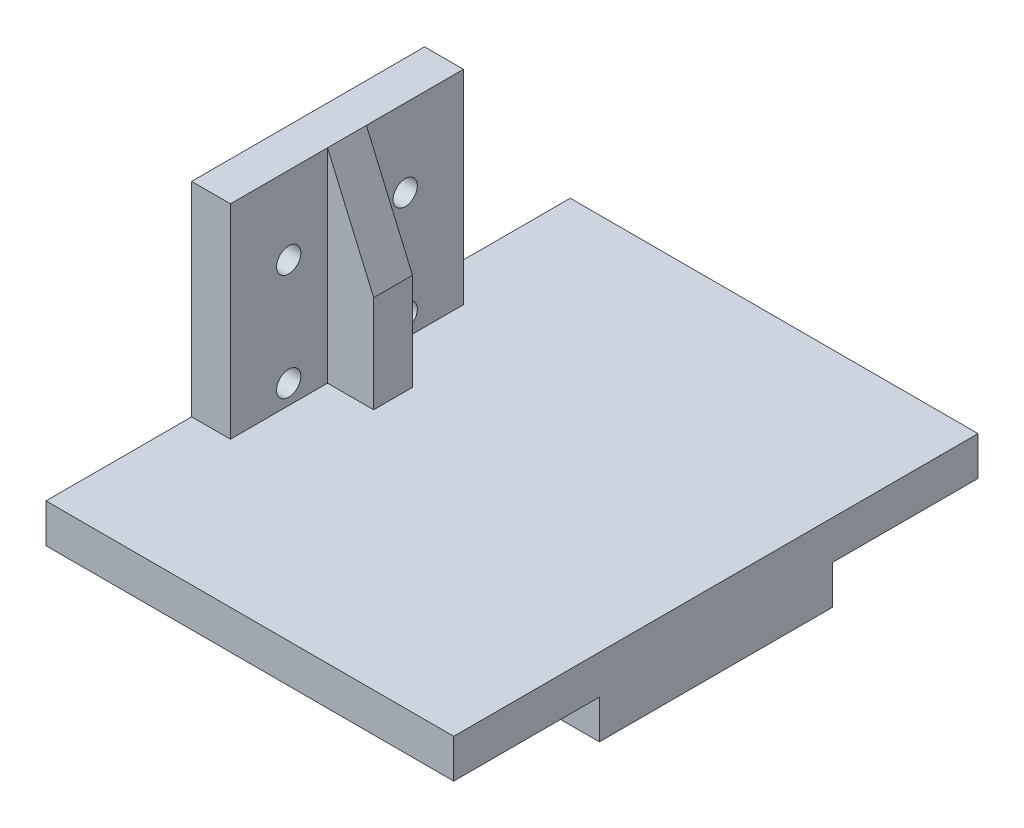
ISO-10303-21;
HEADER;
FILE_DESCRIPTION(('STEP AP214'),'2;1');
FILE_NAME('part.step','',(''),(''),'','','');
FILE_SCHEMA(('AUTOMOTIVE_DESIGN { 1 0 10303 214 1 1 1 1 }'));
ENDSEC;
DATA;
#1=APPLICATION_CONTEXT('core data for automotive mechanical design processes');
#2=APPLICATION_PROTOCOL_DEFINITION('international standard','automotive_design',2000,#1);
#3=PRODUCT_CONTEXT('',#1,'mechanical');
#4=PRODUCT('Part','Part','',(#3));
#5=PRODUCT_RELATED_PRODUCT_CATEGORY('part','',(#4));
#6=PRODUCT_DEFINITION_FORMATION('','',#4);
#7=PRODUCT_DEFINITION_CONTEXT('part definition',#1,'design');
#8=PRODUCT_DEFINITION('design','',#6,#7);
#9=PRODUCT_DEFINITION_SHAPE('','',#8);
#10=(LENGTH_UNIT() NAMED_UNIT(*) SI_UNIT(.MILLI.,.METRE.));
#11=(NAMED_UNIT(*) PLANE_ANGLE_UNIT() SI_UNIT($,.RADIAN.));
#12=(NAMED_UNIT(*) SI_UNIT($,.STERADIAN.) SOLID_ANGLE_UNIT());
#13=UNCERTAINTY_MEASURE_WITH_UNIT(LENGTH_MEASURE(1.E-05),#10,'distance_accuracy_value','');
#14=(GEOMETRIC_REPRESENTATION_CONTEXT(3) GLOBAL_UNCERTAINTY_ASSIGNED_CONTEXT((#13)) GLOBAL_UNIT_ASSIGNED_CONTEXT((#10,
#11,#12)) REPRESENTATION_CONTEXT('',''));
#15=CARTESIAN_POINT('',(0.,0.,0.));
#16=DIRECTION('',(0.,0.,1.));
#17=DIRECTION('',(1.,0.,0.));
#18=AXIS2_PLACEMENT_3D('',#15,#16,#17);
#19=CARTESIAN_POINT('',(4.,29.,-24.));
#20=DIRECTION('',(1.,0.,0.));
#21=DIRECTION('',(0.,1.,0.));
#22=AXIS2_PLACEMENT_3D('',#19,#20,#21);
#23=PLANE('',#22);
#24=CARTESIAN_POINT('',(4.,10.,-5.99999999999999));
#25=DIRECTION('',(1.,0.,0.));
#26=DIRECTION('',(0.,1.,0.));
#27=AXIS2_PLACEMENT_3D('',#24,#25,#26);
#28=CIRCLE('',#27,1.25);
#29=CARTESIAN_POINT('',(4.,11.25,-5.99999999999999));
#30=VERTEX_POINT('',#29);
#31=EDGE_CURVE('E294',#30,#30,#28,.T.);
#32=ORIENTED_EDGE('',*,*,#31,.F.);
#33=EDGE_LOOP('',(#32));
#34=FACE_BOUND('',#33,.T.);
#35=CARTESIAN_POINT('',(4.,21.,-5.99999999999999));
#36=DIRECTION('',(1.,0.,0.));
#37=DIRECTION('',(0.,1.,0.));
#38=AXIS2_PLACEMENT_3D('',#35,#36,#37);
#39=CIRCLE('',#38,1.25);
#40=CARTESIAN_POINT('',(4.,22.25,-5.99999999999999));
#41=VERTEX_POINT('',#40);
#42=EDGE_CURVE('E286',#41,#41,#39,.T.);
#43=ORIENTED_EDGE('',*,*,#42,.F.);
#44=EDGE_LOOP('',(#43));
#45=FACE_BOUND('',#44,.T.);
#46=DIRECTION('',(0.,0.,1.));
#47=VECTOR('',#46,1.);
#48=CARTESIAN_POINT('',(4.,8.,-24.));
#49=LINE('',#48,#47);
#50=CARTESIAN_POINT('',(4.,8.,-10.));
#51=VERTEX_POINT('',#50);
#52=CARTESIAN_POINT('',(4.,8.,0.));
#53=VERTEX_POINT('',#52);
#54=EDGE_CURVE('E175',#51,#53,#49,.T.);
#55=ORIENTED_EDGE('',*,*,#54,.F.);
#56=DIRECTION('',(0.,-1.,0.));
#57=VECTOR('',#56,1.);
#58=CARTESIAN_POINT('',(4.,29.,-10.));
#59=LINE('',#58,#57);
#60=CARTESIAN_POINT('',(4.,29.,-10.));
#61=VERTEX_POINT('',#60);
#62=EDGE_CURVE('E52',#61,#51,#59,.T.);
#63=ORIENTED_EDGE('',*,*,#62,.F.);
#64=DIRECTION('',(0.,0.,1.));
#65=VECTOR('',#64,1.);
#66=CARTESIAN_POINT('',(4.,29.,-24.));
#67=LINE('',#66,#65);
#68=CARTESIAN_POINT('',(4.,29.,0.));
#69=VERTEX_POINT('',#68);
#70=EDGE_CURVE('E173',#61,#69,#67,.T.);
#71=ORIENTED_EDGE('',*,*,#70,.T.);
#72=DIRECTION('',(0.,1.,0.));
#73=VECTOR('',#72,1.);
#74=CARTESIAN_POINT('',(4.,29.,0.));
#75=LINE('',#74,#73);
#76=EDGE_CURVE('E199',#53,#69,#75,.T.);
#77=ORIENTED_EDGE('',*,*,#76,.F.);
#78=EDGE_LOOP('',(#55,#63,#71,#77));
#79=FACE_BOUND('',#78,.T.);
#80=ADVANCED_FACE('F35',(#34,#45,#79),#23,.T.);
#81=CARTESIAN_POINT('',(0.,0.,-24.));
#82=DIRECTION('',(0.,0.,-1.));
#83=DIRECTION('',(-1.,0.,0.));
#84=AXIS2_PLACEMENT_3D('',#81,#82,#83);
#85=PLANE('',#84);
#86=DIRECTION('',(0.,1.,0.));
#87=VECTOR('',#86,1.);
#88=CARTESIAN_POINT('',(4.,29.,-24.));
#89=LINE('',#88,#87);
#90=CARTESIAN_POINT('',(4.00000000000005,8.,-24.));
#91=VERTEX_POINT('',#90);
#92=CARTESIAN_POINT('',(4.,29.,-24.));
#93=VERTEX_POINT('',#92);
#94=EDGE_CURVE('E235',#91,#93,#89,.T.);
#95=ORIENTED_EDGE('',*,*,#94,.F.);
#96=DIRECTION('',(-1.,0.,0.));
#97=VECTOR('',#96,1.);
#98=CARTESIAN_POINT('',(42.,8.,-24.));
#99=LINE('',#98,#97);
#100=CARTESIAN_POINT('',(0.,8.,-24.));
#101=VERTEX_POINT('',#100);
#102=EDGE_CURVE('E11',#91,#101,#99,.T.);
#103=ORIENTED_EDGE('',*,*,#102,.T.);
#104=DIRECTION('',(0.,-1.,0.));
#105=VECTOR('',#104,1.);
#106=CARTESIAN_POINT('',(0.,0.,-24.));
#107=LINE('',#106,#105);
#108=CARTESIAN_POINT('',(0.,29.,-24.));
#109=VERTEX_POINT('',#108);
#110=EDGE_CURVE('E195',#109,#101,#107,.T.);
#111=ORIENTED_EDGE('',*,*,#110,.F.);
#112=DIRECTION('',(-1.,0.,0.));
#113=VECTOR('',#112,1.);
#114=CARTESIAN_POINT('',(0.,29.,-24.));
#115=LINE('',#114,#113);
#116=EDGE_CURVE('E231',#93,#109,#115,.T.);
#117=ORIENTED_EDGE('',*,*,#116,.F.);
#118=EDGE_LOOP('',(#95,#103,#111,#117));
#119=FACE_BOUND('',#118,.T.);
#120=ADVANCED_FACE('F349',(#119),#85,.T.);
#121=CARTESIAN_POINT('',(0.,4.,-24.));
#122=VERTEX_POINT('',#121);
#123=CARTESIAN_POINT('',(0.,0.,-24.));
#124=VERTEX_POINT('',#123);
#125=EDGE_CURVE('E236',#122,#124,#107,.T.);
#126=ORIENTED_EDGE('',*,*,#125,.F.);
#127=DIRECTION('',(1.,0.,0.));
#128=VECTOR('',#127,1.);
#129=CARTESIAN_POINT('',(42.,4.,-24.));
#130=LINE('',#129,#128);
#131=CARTESIAN_POINT('',(42.,4.,-24.));
#132=VERTEX_POINT('',#131);
#133=EDGE_CURVE('E240',#122,#132,#130,.T.);
#134=ORIENTED_EDGE('',*,*,#133,.T.);
#135=DIRECTION('',(0.,1.,0.));
#136=VECTOR('',#135,1.);
#137=CARTESIAN_POINT('',(42.,8.,-24.));
#138=LINE('',#137,#136);
#139=CARTESIAN_POINT('',(42.,0.,-24.));
#140=VERTEX_POINT('',#139);
#141=EDGE_CURVE('E228',#140,#132,#138,.T.);
#142=ORIENTED_EDGE('',*,*,#141,.F.);
#143=DIRECTION('',(1.,0.,0.));
#144=VECTOR('',#143,1.);
#145=CARTESIAN_POINT('',(42.,0.,-24.));
#146=LINE('',#145,#144);
#147=EDGE_CURVE('E225',#124,#140,#146,.T.);
#148=ORIENTED_EDGE('',*,*,#147,.F.);
#149=EDGE_LOOP('',(#126,#134,#142,#148));
#150=FACE_BOUND('',#149,.T.);
#151=ADVANCED_FACE('F372',(#150),#85,.T.);
#152=CARTESIAN_POINT('',(0.,0.,0.));
#153=DIRECTION('',(0.,0.,-1.));
#154=DIRECTION('',(-1.,0.,0.));
#155=AXIS2_PLACEMENT_3D('',#152,#153,#154);
#156=PLANE('',#155);
#157=DIRECTION('',(-1.,0.,0.));
#158=VECTOR('',#157,1.);
#159=CARTESIAN_POINT('',(42.,8.,0.));
#160=LINE('',#159,#158);
#161=CARTESIAN_POINT('',(0.,7.99999999999999,0.));
#162=VERTEX_POINT('',#161);
#163=EDGE_CURVE('E44',#53,#162,#160,.T.);
#164=ORIENTED_EDGE('',*,*,#163,.F.);
#165=ORIENTED_EDGE('',*,*,#76,.T.);
#166=DIRECTION('',(-1.,0.,0.));
#167=VECTOR('',#166,1.);
#168=CARTESIAN_POINT('',(0.,29.,0.));
#169=LINE('',#168,#167);
#170=CARTESIAN_POINT('',(0.,29.,0.));
#171=VERTEX_POINT('',#170);
#172=EDGE_CURVE('E180',#69,#171,#169,.T.);
#173=ORIENTED_EDGE('',*,*,#172,.T.);
#174=DIRECTION('',(0.,-1.,0.));
#175=VECTOR('',#174,1.);
#176=CARTESIAN_POINT('',(0.,0.,0.));
#177=LINE('',#176,#175);
#178=EDGE_CURVE('E201',#171,#162,#177,.T.);
#179=ORIENTED_EDGE('',*,*,#178,.T.);
#180=EDGE_LOOP('',(#164,#165,#173,#179));
#181=FACE_BOUND('',#180,.T.);
#182=ADVANCED_FACE('F531',(#181),#156,.F.);
#183=DIRECTION('',(1.,0.,0.));
#184=VECTOR('',#183,1.);
#185=CARTESIAN_POINT('',(42.,4.,0.));
#186=LINE('',#185,#184);
#187=CARTESIAN_POINT('',(0.,3.99999999999999,0.));
#188=VERTEX_POINT('',#187);
#189=CARTESIAN_POINT('',(42.,4.,0.));
#190=VERTEX_POINT('',#189);
#191=EDGE_CURVE('E216',#188,#190,#186,.T.);
#192=ORIENTED_EDGE('',*,*,#191,.F.);
#193=CARTESIAN_POINT('',(0.,0.,0.));
#194=VERTEX_POINT('',#193);
#195=EDGE_CURVE('E208',#188,#194,#177,.T.);
#196=ORIENTED_EDGE('',*,*,#195,.T.);
#197=DIRECTION('',(1.,0.,0.));
#198=VECTOR('',#197,1.);
#199=CARTESIAN_POINT('',(42.,0.,0.));
#200=LINE('',#199,#198);
#201=CARTESIAN_POINT('',(42.,0.,0.));
#202=VERTEX_POINT('',#201);
#203=EDGE_CURVE('E200',#194,#202,#200,.T.);
#204=ORIENTED_EDGE('',*,*,#203,.T.);
#205=DIRECTION('',(0.,1.,0.));
#206=VECTOR('',#205,1.);
#207=CARTESIAN_POINT('',(42.,8.,0.));
#208=LINE('',#207,#206);
#209=EDGE_CURVE('E196',#202,#190,#208,.T.);
#210=ORIENTED_EDGE('',*,*,#209,.T.);
#211=EDGE_LOOP('',(#192,#196,#204,#210));
#212=FACE_BOUND('',#211,.T.);
#213=ADVANCED_FACE('F548',(#212),#156,.F.);
#214=CARTESIAN_POINT('',(42.,0.,-24.));
#215=DIRECTION('',(0.,-1.,0.));
#216=DIRECTION('',(1.,0.,0.));
#217=AXIS2_PLACEMENT_3D('',#214,#215,#216);
#218=PLANE('',#217);
#219=ORIENTED_EDGE('',*,*,#203,.F.);
#220=DIRECTION('',(0.,0.,1.));
#221=VECTOR('',#220,1.);
#222=CARTESIAN_POINT('',(0.,0.,-24.));
#223=LINE('',#222,#221);
#224=EDGE_CURVE('E210',#124,#194,#223,.T.);
#225=ORIENTED_EDGE('',*,*,#224,.F.);
#226=ORIENTED_EDGE('',*,*,#147,.T.);
#227=DIRECTION('',(0.,0.,1.));
#228=VECTOR('',#227,1.);
#229=CARTESIAN_POINT('',(42.,0.,-24.));
#230=LINE('',#229,#228);
#231=EDGE_CURVE('E193',#140,#202,#230,.T.);
#232=ORIENTED_EDGE('',*,*,#231,.T.);
#233=EDGE_LOOP('',(#219,#225,#226,#232));
#234=FACE_BOUND('',#233,.T.);
#235=ADVANCED_FACE('F37',(#234),#218,.T.);
#236=CARTESIAN_POINT('',(0.,0.,-24.));
#237=DIRECTION('',(-1.,0.,0.));
#238=DIRECTION('',(0.,0.,1.));
#239=AXIS2_PLACEMENT_3D('',#236,#237,#238);
#240=PLANE('',#239);
#241=CARTESIAN_POINT('',(0.,21.,-18.));
#242=DIRECTION('',(-1.,0.,0.));
#243=DIRECTION('',(0.,0.,1.));
#244=AXIS2_PLACEMENT_3D('',#241,#242,#243);
#245=CIRCLE('',#244,1.25);
#246=CARTESIAN_POINT('',(0.,21.,-16.75));
#247=VERTEX_POINT('',#246);
#248=EDGE_CURVE('E394',#247,#247,#245,.T.);
#249=ORIENTED_EDGE('',*,*,#248,.F.);
#250=EDGE_LOOP('',(#249));
#251=FACE_BOUND('',#250,.T.);
#252=CARTESIAN_POINT('',(0.,10.,-18.));
#253=DIRECTION('',(-1.,0.,0.));
#254=DIRECTION('',(0.,0.,1.));
#255=AXIS2_PLACEMENT_3D('',#252,#253,#254);
#256=CIRCLE('',#255,1.25);
#257=CARTESIAN_POINT('',(0.,10.,-16.75));
#258=VERTEX_POINT('',#257);
#259=EDGE_CURVE('E393',#258,#258,#256,.T.);
#260=ORIENTED_EDGE('',*,*,#259,.F.);
#261=EDGE_LOOP('',(#260));
#262=FACE_BOUND('',#261,.T.);
#263=CARTESIAN_POINT('',(0.,10.,-5.99999999999999));
#264=DIRECTION('',(-1.,0.,0.));
#265=DIRECTION('',(0.,0.,1.));
#266=AXIS2_PLACEMENT_3D('',#263,#264,#265);
#267=CIRCLE('',#266,1.25);
#268=CARTESIAN_POINT('',(0.,10.,-4.75));
#269=VERTEX_POINT('',#268);
#270=EDGE_CURVE('E39',#269,#269,#267,.T.);
#271=ORIENTED_EDGE('',*,*,#270,.F.);
#272=EDGE_LOOP('',(#271));
#273=FACE_BOUND('',#272,.T.);
#274=CARTESIAN_POINT('',(0.,21.,-5.99999999999999));
#275=DIRECTION('',(-1.,0.,0.));
#276=DIRECTION('',(0.,0.,1.));
#277=AXIS2_PLACEMENT_3D('',#274,#275,#276);
#278=CIRCLE('',#277,1.25);
#279=CARTESIAN_POINT('',(0.,21.,-4.74999999999999));
#280=VERTEX_POINT('',#279);
#281=EDGE_CURVE('E168',#280,#280,#278,.T.);
#282=ORIENTED_EDGE('',*,*,#281,.F.);
#283=EDGE_LOOP('',(#282));
#284=FACE_BOUND('',#283,.T.);
#285=ORIENTED_EDGE('',*,*,#178,.F.);
#286=DIRECTION('',(0.,0.,1.));
#287=VECTOR('',#286,1.);
#288=CARTESIAN_POINT('',(0.,29.,-24.));
#289=LINE('',#288,#287);
#290=EDGE_CURVE('E185',#109,#171,#289,.T.);
#291=ORIENTED_EDGE('',*,*,#290,.F.);
#292=ORIENTED_EDGE('',*,*,#110,.T.);
#293=DIRECTION('',(0.,0.,1.));
#294=VECTOR('',#293,1.);
#295=CARTESIAN_POINT('',(0.,8.00000000000001,-39.));
#296=LINE('',#295,#294);
#297=CARTESIAN_POINT('',(0.,8.00000000000001,-39.));
#298=VERTEX_POINT('',#297);
#299=EDGE_CURVE('E321',#298,#101,#296,.T.);
#300=ORIENTED_EDGE('',*,*,#299,.F.);
#301=DIRECTION('',(0.,-1.,0.));
#302=VECTOR('',#301,1.);
#303=CARTESIAN_POINT('',(0.,8.00000000000001,-39.));
#304=LINE('',#303,#302);
#305=CARTESIAN_POINT('',(0.,4.00000000000001,-39.));
#306=VERTEX_POINT('',#305);
#307=EDGE_CURVE('E245',#298,#306,#304,.T.);
#308=ORIENTED_EDGE('',*,*,#307,.T.);
#309=DIRECTION('',(0.,0.,1.));
#310=VECTOR('',#309,1.);
#311=CARTESIAN_POINT('',(0.,4.00000000000001,-39.));
#312=LINE('',#311,#310);
#313=EDGE_CURVE('E324',#306,#122,#312,.T.);
#314=ORIENTED_EDGE('',*,*,#313,.T.);
#315=ORIENTED_EDGE('',*,*,#125,.T.);
#316=ORIENTED_EDGE('',*,*,#224,.T.);
#317=ORIENTED_EDGE('',*,*,#195,.F.);
#318=DIRECTION('',(0.,0.,-1.));
#319=VECTOR('',#318,1.);
#320=CARTESIAN_POINT('',(0.,4.,15.));
#321=LINE('',#320,#319);
#322=CARTESIAN_POINT('',(0.,4.,15.));
#323=VERTEX_POINT('',#322);
#324=EDGE_CURVE('E262',#323,#188,#321,.T.);
#325=ORIENTED_EDGE('',*,*,#324,.F.);
#326=DIRECTION('',(0.,-1.,0.));
#327=VECTOR('',#326,1.);
#328=CARTESIAN_POINT('',(0.,8.,15.));
#329=LINE('',#328,#327);
#330=CARTESIAN_POINT('',(0.,8.,15.));
#331=VERTEX_POINT('',#330);
#332=EDGE_CURVE('E252',#331,#323,#329,.T.);
#333=ORIENTED_EDGE('',*,*,#332,.F.);
#334=DIRECTION('',(0.,0.,-1.));
#335=VECTOR('',#334,1.);
#336=CARTESIAN_POINT('',(0.,8.,15.));
#337=LINE('',#336,#335);
#338=EDGE_CURVE('E266',#331,#162,#337,.T.);
#339=ORIENTED_EDGE('',*,*,#338,.T.);
#340=EDGE_LOOP('',(#285,#291,#292,#300,#308,#314,#315,#316,#317,#325,#333,#339));
#341=FACE_BOUND('',#340,.T.);
#342=ADVANCED_FACE('F347',(#251,#262,#273,#284,#341),#240,.T.);
#343=CARTESIAN_POINT('',(0.,29.,-24.));
#344=DIRECTION('',(0.,1.,0.));
#345=DIRECTION('',(0.,0.,1.));
#346=AXIS2_PLACEMENT_3D('',#343,#344,#345);
#347=PLANE('',#346);
#348=ORIENTED_EDGE('',*,*,#172,.F.);
#349=ORIENTED_EDGE('',*,*,#70,.F.);
#350=DIRECTION('',(0.,0.,1.));
#351=VECTOR('',#350,1.);
#352=CARTESIAN_POINT('',(4.,29.,-14.));
#353=LINE('',#352,#351);
#354=CARTESIAN_POINT('',(4.,29.,-14.));
#355=VERTEX_POINT('',#354);
#356=EDGE_CURVE('E153',#355,#61,#353,.T.);
#357=ORIENTED_EDGE('',*,*,#356,.F.);
#358=EDGE_CURVE('E182',#93,#355,#67,.T.);
#359=ORIENTED_EDGE('',*,*,#358,.F.);
#360=ORIENTED_EDGE('',*,*,#116,.T.);
#361=ORIENTED_EDGE('',*,*,#290,.T.);
#362=EDGE_LOOP('',(#348,#349,#357,#359,#360,#361));
#363=FACE_BOUND('',#362,.T.);
#364=ADVANCED_FACE('F178',(#363),#347,.T.);
#365=CARTESIAN_POINT('',(4.,21.,-18.));
#366=DIRECTION('',(1.,0.,0.));
#367=DIRECTION('',(0.,1.,0.));
#368=AXIS2_PLACEMENT_3D('',#365,#366,#367);
#369=CIRCLE('',#368,1.25);
#370=CARTESIAN_POINT('',(4.,22.25,-18.));
#371=VERTEX_POINT('',#370);
#372=EDGE_CURVE('E388',#371,#371,#369,.T.);
#373=ORIENTED_EDGE('',*,*,#372,.F.);
#374=EDGE_LOOP('',(#373));
#375=FACE_BOUND('',#374,.T.);
#376=CARTESIAN_POINT('',(4.,10.,-18.));
#377=DIRECTION('',(1.,0.,0.));
#378=DIRECTION('',(0.,1.,0.));
#379=AXIS2_PLACEMENT_3D('',#376,#377,#378);
#380=CIRCLE('',#379,1.25);
#381=CARTESIAN_POINT('',(4.,11.25,-18.));
#382=VERTEX_POINT('',#381);
#383=EDGE_CURVE('E391',#382,#382,#380,.T.);
#384=ORIENTED_EDGE('',*,*,#383,.F.);
#385=EDGE_LOOP('',(#384));
#386=FACE_BOUND('',#385,.T.);
#387=DIRECTION('',(0.,-1.,0.));
#388=VECTOR('',#387,1.);
#389=CARTESIAN_POINT('',(4.,29.,-14.));
#390=LINE('',#389,#388);
#391=CARTESIAN_POINT('',(4.,8.,-14.));
#392=VERTEX_POINT('',#391);
#393=EDGE_CURVE('E301',#355,#392,#390,.T.);
#394=ORIENTED_EDGE('',*,*,#393,.T.);
#395=EDGE_CURVE('E183',#91,#392,#49,.T.);
#396=ORIENTED_EDGE('',*,*,#395,.F.);
#397=ORIENTED_EDGE('',*,*,#94,.T.);
#398=ORIENTED_EDGE('',*,*,#358,.T.);
#399=EDGE_LOOP('',(#394,#396,#397,#398));
#400=FACE_BOUND('',#399,.T.);
#401=ADVANCED_FACE('F351',(#375,#386,#400),#23,.T.);
#402=CARTESIAN_POINT('',(4.,8.,-24.));
#403=DIRECTION('',(0.,1.,0.));
#404=DIRECTION('',(0.,0.,1.));
#405=AXIS2_PLACEMENT_3D('',#402,#403,#404);
#406=PLANE('',#405);
#407=DIRECTION('',(1.,0.,0.));
#408=VECTOR('',#407,1.);
#409=CARTESIAN_POINT('',(4.,8.,-14.));
#410=LINE('',#409,#408);
#411=CARTESIAN_POINT('',(8.75,8.,-14.));
#412=VERTEX_POINT('',#411);
#413=EDGE_CURVE('E304',#392,#412,#410,.T.);
#414=ORIENTED_EDGE('',*,*,#413,.T.);
#415=DIRECTION('',(0.,0.,1.));
#416=VECTOR('',#415,1.);
#417=CARTESIAN_POINT('',(8.75,8.,-14.));
#418=LINE('',#417,#416);
#419=CARTESIAN_POINT('',(8.75,8.,-10.));
#420=VERTEX_POINT('',#419);
#421=EDGE_CURVE('E161',#412,#420,#418,.T.);
#422=ORIENTED_EDGE('',*,*,#421,.T.);
#423=DIRECTION('',(1.,0.,0.));
#424=VECTOR('',#423,1.);
#425=CARTESIAN_POINT('',(4.,8.,-10.));
#426=LINE('',#425,#424);
#427=EDGE_CURVE('E176',#51,#420,#426,.T.);
#428=ORIENTED_EDGE('',*,*,#427,.F.);
#429=ORIENTED_EDGE('',*,*,#54,.T.);
#430=ORIENTED_EDGE('',*,*,#163,.T.);
#431=ORIENTED_EDGE('',*,*,#338,.F.);
#432=DIRECTION('',(-1.,0.,0.));
#433=VECTOR('',#432,1.);
#434=CARTESIAN_POINT('',(42.,8.,15.));
#435=LINE('',#434,#433);
#436=CARTESIAN_POINT('',(42.,8.,15.));
#437=VERTEX_POINT('',#436);
#438=EDGE_CURVE('E249',#437,#331,#435,.T.);
#439=ORIENTED_EDGE('',*,*,#438,.F.);
#440=DIRECTION('',(0.,0.,1.));
#441=VECTOR('',#440,1.);
#442=CARTESIAN_POINT('',(42.,8.,-24.));
#443=LINE('',#442,#441);
#444=CARTESIAN_POINT('',(42.,8.00000000000001,-39.));
#445=VERTEX_POINT('',#444);
#446=EDGE_CURVE('E191',#445,#437,#443,.T.);
#447=ORIENTED_EDGE('',*,*,#446,.F.);
#448=DIRECTION('',(-1.,0.,0.));
#449=VECTOR('',#448,1.);
#450=CARTESIAN_POINT('',(42.,8.00000000000001,-39.));
#451=LINE('',#450,#449);
#452=EDGE_CURVE('E313',#445,#298,#451,.T.);
#453=ORIENTED_EDGE('',*,*,#452,.T.);
#454=ORIENTED_EDGE('',*,*,#299,.T.);
#455=ORIENTED_EDGE('',*,*,#102,.F.);
#456=ORIENTED_EDGE('',*,*,#395,.T.);
#457=EDGE_LOOP('',(#414,#422,#428,#429,#430,#431,#439,#447,#453,#454,#455,#456));
#458=FACE_BOUND('',#457,.T.);
#459=ADVANCED_FACE('F350',(#458),#406,.T.);
#460=CARTESIAN_POINT('',(42.,8.,-24.));
#461=DIRECTION('',(1.,0.,0.));
#462=DIRECTION('',(0.,0.,-1.));
#463=AXIS2_PLACEMENT_3D('',#460,#461,#462);
#464=PLANE('',#463);
#465=ORIENTED_EDGE('',*,*,#209,.F.);
#466=ORIENTED_EDGE('',*,*,#231,.F.);
#467=ORIENTED_EDGE('',*,*,#141,.T.);
#468=DIRECTION('',(0.,0.,1.));
#469=VECTOR('',#468,1.);
#470=CARTESIAN_POINT('',(42.,4.00000000000001,-39.));
#471=LINE('',#470,#469);
#472=CARTESIAN_POINT('',(42.,4.00000000000001,-39.));
#473=VERTEX_POINT('',#472);
#474=EDGE_CURVE('E60',#473,#132,#471,.T.);
#475=ORIENTED_EDGE('',*,*,#474,.F.);
#476=DIRECTION('',(0.,1.,0.));
#477=VECTOR('',#476,1.);
#478=CARTESIAN_POINT('',(42.,8.00000000000001,-39.));
#479=LINE('',#478,#477);
#480=EDGE_CURVE('E316',#473,#445,#479,.T.);
#481=ORIENTED_EDGE('',*,*,#480,.T.);
#482=ORIENTED_EDGE('',*,*,#446,.T.);
#483=DIRECTION('',(0.,1.,0.));
#484=VECTOR('',#483,1.);
#485=CARTESIAN_POINT('',(42.,8.,15.));
#486=LINE('',#485,#484);
#487=CARTESIAN_POINT('',(42.,4.,15.));
#488=VERTEX_POINT('',#487);
#489=EDGE_CURVE('E221',#488,#437,#486,.T.);
#490=ORIENTED_EDGE('',*,*,#489,.F.);
#491=DIRECTION('',(0.,0.,-1.));
#492=VECTOR('',#491,1.);
#493=CARTESIAN_POINT('',(42.,4.,15.));
#494=LINE('',#493,#492);
#495=EDGE_CURVE('E258',#488,#190,#494,.T.);
#496=ORIENTED_EDGE('',*,*,#495,.T.);
#497=EDGE_LOOP('',(#465,#466,#467,#475,#481,#482,#490,#496));
#498=FACE_BOUND('',#497,.T.);
#499=ADVANCED_FACE('F384',(#498),#464,.T.);
#500=CARTESIAN_POINT('',(42.,4.,15.));
#501=DIRECTION('',(0.,1.,0.));
#502=DIRECTION('',(-1.,0.,0.));
#503=AXIS2_PLACEMENT_3D('',#500,#501,#502);
#504=PLANE('',#503);
#505=ORIENTED_EDGE('',*,*,#191,.T.);
#506=ORIENTED_EDGE('',*,*,#495,.F.);
#507=DIRECTION('',(1.,0.,0.));
#508=VECTOR('',#507,1.);
#509=CARTESIAN_POINT('',(42.,4.,15.));
#510=LINE('',#509,#508);
#511=EDGE_CURVE('E253',#323,#488,#510,.T.);
#512=ORIENTED_EDGE('',*,*,#511,.F.);
#513=ORIENTED_EDGE('',*,*,#324,.T.);
#514=EDGE_LOOP('',(#505,#506,#512,#513));
#515=FACE_BOUND('',#514,.T.);
#516=ADVANCED_FACE('F494',(#515),#504,.F.);
#517=CARTESIAN_POINT('',(0.,0.,15.));
#518=DIRECTION('',(0.,0.,1.));
#519=DIRECTION('',(1.,0.,0.));
#520=AXIS2_PLACEMENT_3D('',#517,#518,#519);
#521=PLANE('',#520);
#522=ORIENTED_EDGE('',*,*,#438,.T.);
#523=ORIENTED_EDGE('',*,*,#332,.T.);
#524=ORIENTED_EDGE('',*,*,#511,.T.);
#525=ORIENTED_EDGE('',*,*,#489,.T.);
#526=EDGE_LOOP('',(#522,#523,#524,#525));
#527=FACE_BOUND('',#526,.T.);
#528=ADVANCED_FACE('F485',(#527),#521,.T.);
#529=CARTESIAN_POINT('',(42.,4.00000000000001,-39.));
#530=DIRECTION('',(0.,-1.,0.));
#531=DIRECTION('',(0.,0.,-1.));
#532=AXIS2_PLACEMENT_3D('',#529,#530,#531);
#533=PLANE('',#532);
#534=ORIENTED_EDGE('',*,*,#133,.F.);
#535=ORIENTED_EDGE('',*,*,#313,.F.);
#536=DIRECTION('',(1.,0.,0.));
#537=VECTOR('',#536,1.);
#538=CARTESIAN_POINT('',(42.,4.00000000000001,-39.));
#539=LINE('',#538,#537);
#540=EDGE_CURVE('E318',#306,#473,#539,.T.);
#541=ORIENTED_EDGE('',*,*,#540,.T.);
#542=ORIENTED_EDGE('',*,*,#474,.T.);
#543=EDGE_LOOP('',(#534,#535,#541,#542));
#544=FACE_BOUND('',#543,.T.);
#545=ADVANCED_FACE('F475',(#544),#533,.T.);
#546=CARTESIAN_POINT('',(0.,0.,-39.));
#547=DIRECTION('',(0.,0.,-1.));
#548=DIRECTION('',(1.,0.,0.));
#549=AXIS2_PLACEMENT_3D('',#546,#547,#548);
#550=PLANE('',#549);
#551=ORIENTED_EDGE('',*,*,#452,.F.);
#552=ORIENTED_EDGE('',*,*,#480,.F.);
#553=ORIENTED_EDGE('',*,*,#540,.F.);
#554=ORIENTED_EDGE('',*,*,#307,.F.);
#555=EDGE_LOOP('',(#551,#552,#553,#554));
#556=FACE_BOUND('',#555,.T.);
#557=ADVANCED_FACE('F364',(#556),#550,.T.);
#558=CARTESIAN_POINT('',(8.75,18.,-14.));
#559=DIRECTION('',(0.91806235353619,0.396436016299719,0.));
#560=DIRECTION('',(-0.396436016299719,0.91806235353619,0.));
#561=AXIS2_PLACEMENT_3D('',#558,#559,#560);
#562=PLANE('',#561);
#563=ORIENTED_EDGE('',*,*,#356,.T.);
#564=DIRECTION('',(-0.396436016299719,0.918062353536191,0.));
#565=VECTOR('',#564,1.);
#566=CARTESIAN_POINT('',(8.75,18.,-10.));
#567=LINE('',#566,#565);
#568=CARTESIAN_POINT('',(8.75,18.,-10.));
#569=VERTEX_POINT('',#568);
#570=EDGE_CURVE('E155',#569,#61,#567,.T.);
#571=ORIENTED_EDGE('',*,*,#570,.F.);
#572=DIRECTION('',(0.,0.,1.));
#573=VECTOR('',#572,1.);
#574=CARTESIAN_POINT('',(8.75,18.,-14.));
#575=LINE('',#574,#573);
#576=CARTESIAN_POINT('',(8.75,18.,-14.));
#577=VERTEX_POINT('',#576);
#578=EDGE_CURVE('E309',#577,#569,#575,.T.);
#579=ORIENTED_EDGE('',*,*,#578,.F.);
#580=DIRECTION('',(-0.396436016299719,0.918062353536191,0.));
#581=VECTOR('',#580,1.);
#582=CARTESIAN_POINT('',(8.75,18.,-14.));
#583=LINE('',#582,#581);
#584=EDGE_CURVE('E157',#577,#355,#583,.T.);
#585=ORIENTED_EDGE('',*,*,#584,.T.);
#586=EDGE_LOOP('',(#563,#571,#579,#585));
#587=FACE_BOUND('',#586,.T.);
#588=ADVANCED_FACE('F154',(#587),#562,.T.);
#589=CARTESIAN_POINT('',(8.75,8.,-14.));
#590=DIRECTION('',(1.,0.,0.));
#591=DIRECTION('',(0.,1.,0.));
#592=AXIS2_PLACEMENT_3D('',#589,#590,#591);
#593=PLANE('',#592);
#594=ORIENTED_EDGE('',*,*,#578,.T.);
#595=DIRECTION('',(0.,1.,0.));
#596=VECTOR('',#595,1.);
#597=CARTESIAN_POINT('',(8.75,8.,-10.));
#598=LINE('',#597,#596);
#599=EDGE_CURVE('E167',#420,#569,#598,.T.);
#600=ORIENTED_EDGE('',*,*,#599,.F.);
#601=ORIENTED_EDGE('',*,*,#421,.F.);
#602=DIRECTION('',(0.,1.,0.));
#603=VECTOR('',#602,1.);
#604=CARTESIAN_POINT('',(8.75,8.,-14.));
#605=LINE('',#604,#603);
#606=EDGE_CURVE('E162',#412,#577,#605,.T.);
#607=ORIENTED_EDGE('',*,*,#606,.T.);
#608=EDGE_LOOP('',(#594,#600,#601,#607));
#609=FACE_BOUND('',#608,.T.);
#610=ADVANCED_FACE('F356',(#609),#593,.T.);
#611=CARTESIAN_POINT('',(0.,0.,-14.));
#612=DIRECTION('',(0.,0.,-1.));
#613=DIRECTION('',(0.,1.,0.));
#614=AXIS2_PLACEMENT_3D('',#611,#612,#613);
#615=PLANE('',#614);
#616=ORIENTED_EDGE('',*,*,#584,.F.);
#617=ORIENTED_EDGE('',*,*,#606,.F.);
#618=ORIENTED_EDGE('',*,*,#413,.F.);
#619=ORIENTED_EDGE('',*,*,#393,.F.);
#620=EDGE_LOOP('',(#616,#617,#618,#619));
#621=FACE_BOUND('',#620,.T.);
#622=ADVANCED_FACE('F353',(#621),#615,.T.);
#623=CARTESIAN_POINT('',(0.,0.,-10.));
#624=DIRECTION('',(0.,0.,-1.));
#625=DIRECTION('',(0.,1.,0.));
#626=AXIS2_PLACEMENT_3D('',#623,#624,#625);
#627=PLANE('',#626);
#628=ORIENTED_EDGE('',*,*,#570,.T.);
#629=ORIENTED_EDGE('',*,*,#62,.T.);
#630=ORIENTED_EDGE('',*,*,#427,.T.);
#631=ORIENTED_EDGE('',*,*,#599,.T.);
#632=EDGE_LOOP('',(#628,#629,#630,#631));
#633=FACE_BOUND('',#632,.T.);
#634=ADVANCED_FACE('F165',(#633),#627,.F.);
#635=CARTESIAN_POINT('',(-5.00000000023051E-05,21.,-5.99999999999999));
#636=DIRECTION('',(1.,0.,0.));
#637=DIRECTION('',(0.,1.,0.));
#638=AXIS2_PLACEMENT_3D('',#635,#636,#637);
#639=CYLINDRICAL_SURFACE('',#638,1.25);
#640=ORIENTED_EDGE('',*,*,#281,.T.);
#641=EDGE_LOOP('',(#640));
#642=FACE_BOUND('',#641,.T.);
#643=ORIENTED_EDGE('',*,*,#42,.T.);
#644=EDGE_LOOP('',(#643));
#645=FACE_BOUND('',#644,.T.);
#646=ADVANCED_FACE('F415',(#642,#645),#639,.F.);
#647=CARTESIAN_POINT('',(-5.00000000005704E-05,10.,-5.99999999999999));
#648=DIRECTION('',(1.,0.,0.));
#649=DIRECTION('',(0.,1.,0.));
#650=AXIS2_PLACEMENT_3D('',#647,#648,#649);
#651=CYLINDRICAL_SURFACE('',#650,1.25);
#652=ORIENTED_EDGE('',*,*,#270,.T.);
#653=EDGE_LOOP('',(#652));
#654=FACE_BOUND('',#653,.T.);
#655=ORIENTED_EDGE('',*,*,#31,.T.);
#656=EDGE_LOOP('',(#655));
#657=FACE_BOUND('',#656,.T.);
#658=ADVANCED_FACE('F409',(#654,#657),#651,.F.);
#659=CARTESIAN_POINT('',(-5.00000000005704E-05,10.,-18.));
#660=DIRECTION('',(1.,0.,0.));
#661=DIRECTION('',(0.,1.,0.));
#662=AXIS2_PLACEMENT_3D('',#659,#660,#661);
#663=CYLINDRICAL_SURFACE('',#662,1.25);
#664=ORIENTED_EDGE('',*,*,#259,.T.);
#665=EDGE_LOOP('',(#664));
#666=FACE_BOUND('',#665,.T.);
#667=ORIENTED_EDGE('',*,*,#383,.T.);
#668=EDGE_LOOP('',(#667));
#669=FACE_BOUND('',#668,.T.);
#670=ADVANCED_FACE('F403',(#666,#669),#663,.F.);
#671=CARTESIAN_POINT('',(-5.00000000023051E-05,21.,-18.));
#672=DIRECTION('',(1.,0.,0.));
#673=DIRECTION('',(0.,1.,0.));
#674=AXIS2_PLACEMENT_3D('',#671,#672,#673);
#675=CYLINDRICAL_SURFACE('',#674,1.25);
#676=ORIENTED_EDGE('',*,*,#248,.T.);
#677=EDGE_LOOP('',(#676));
#678=FACE_BOUND('',#677,.T.);
#679=ORIENTED_EDGE('',*,*,#372,.T.);
#680=EDGE_LOOP('',(#679));
#681=FACE_BOUND('',#680,.T.);
#682=ADVANCED_FACE('F401',(#678,#681),#675,.F.);
#683=CLOSED_SHELL('',(#80,#120,#151,#182,#213,#235,#342,#364,#401,#459,#499,#516,#528,#545,#557,
#588,#610,#622,#634,#646,#658,#670,#682));
#684=MANIFOLD_SOLID_BREP('B2',#683);
#685=ADVANCED_BREP_SHAPE_REPRESENTATION('',(#18,#684),#14);
#686=SHAPE_DEFINITION_REPRESENTATION(#9,#685);
ENDSEC;
END-ISO-10303-21;
